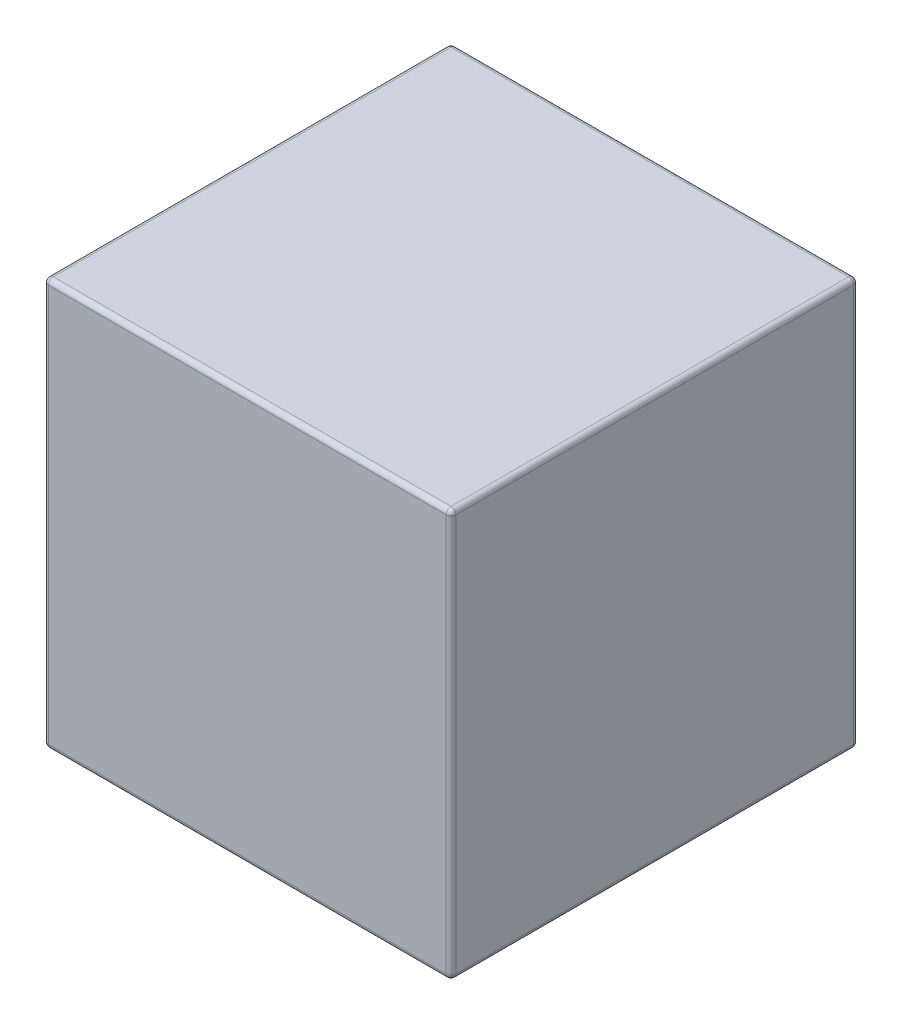
ISO-10303-21;
HEADER;
FILE_DESCRIPTION(('STEP AP214'),'2;1');
FILE_NAME('part.step','',(''),(''),'','','');
FILE_SCHEMA(('AUTOMOTIVE_DESIGN { 1 0 10303 214 1 1 1 1 }'));
ENDSEC;
DATA;
#1=APPLICATION_CONTEXT('core data for automotive mechanical design processes');
#2=APPLICATION_PROTOCOL_DEFINITION('international standard','automotive_design',2000,#1);
#3=PRODUCT_CONTEXT('',#1,'mechanical');
#4=PRODUCT('Part','Part','',(#3));
#5=PRODUCT_RELATED_PRODUCT_CATEGORY('part','',(#4));
#6=PRODUCT_DEFINITION_FORMATION('','',#4);
#7=PRODUCT_DEFINITION_CONTEXT('part definition',#1,'design');
#8=PRODUCT_DEFINITION('design','',#6,#7);
#9=PRODUCT_DEFINITION_SHAPE('','',#8);
#10=(LENGTH_UNIT() NAMED_UNIT(*) SI_UNIT(.MILLI.,.METRE.));
#11=(NAMED_UNIT(*) PLANE_ANGLE_UNIT() SI_UNIT($,.RADIAN.));
#12=(NAMED_UNIT(*) SI_UNIT($,.STERADIAN.) SOLID_ANGLE_UNIT());
#13=UNCERTAINTY_MEASURE_WITH_UNIT(LENGTH_MEASURE(1.E-05),#10,'distance_accuracy_value','');
#14=(GEOMETRIC_REPRESENTATION_CONTEXT(3) GLOBAL_UNCERTAINTY_ASSIGNED_CONTEXT((#13)) GLOBAL_UNIT_ASSIGNED_CONTEXT((#10,
#11,#12)) REPRESENTATION_CONTEXT('',''));
#15=CARTESIAN_POINT('',(0.,0.,0.));
#16=DIRECTION('',(0.,0.,1.));
#17=DIRECTION('',(1.,0.,0.));
#18=AXIS2_PLACEMENT_3D('',#15,#16,#17);
#19=CARTESIAN_POINT('',(0.,-42.,42.));
#20=DIRECTION('',(0.,1.,0.));
#21=DIRECTION('',(0.,0.,1.));
#22=AXIS2_PLACEMENT_3D('',#19,#20,#21);
#23=PLANE('',#22);
#24=DIRECTION('',(0.,0.,-1.));
#25=VECTOR('',#24,1.);
#26=CARTESIAN_POINT('',(14.25,-42.,38.25));
#27=LINE('',#26,#25);
#28=CARTESIAN_POINT('',(14.25,-42.,38.25));
#29=VERTEX_POINT('',#28);
#30=CARTESIAN_POINT('',(14.25,-42.,27.75));
#31=VERTEX_POINT('',#30);
#32=EDGE_CURVE('E58',#29,#31,#27,.T.);
#33=ORIENTED_EDGE('',*,*,#32,.T.);
#34=DIRECTION('',(-1.,0.,0.));
#35=VECTOR('',#34,1.);
#36=CARTESIAN_POINT('',(14.25,-42.,27.75));
#37=LINE('',#36,#35);
#38=CARTESIAN_POINT('',(3.75,-42.,27.75));
#39=VERTEX_POINT('',#38);
#40=EDGE_CURVE('E264',#31,#39,#37,.T.);
#41=ORIENTED_EDGE('',*,*,#40,.T.);
#42=DIRECTION('',(0.,0.,1.));
#43=VECTOR('',#42,1.);
#44=CARTESIAN_POINT('',(3.75000000000001,-42.,38.25));
#45=LINE('',#44,#43);
#46=CARTESIAN_POINT('',(3.75000000000001,-42.,38.25));
#47=VERTEX_POINT('',#46);
#48=EDGE_CURVE('E275',#39,#47,#45,.T.);
#49=ORIENTED_EDGE('',*,*,#48,.T.);
#50=DIRECTION('',(1.,0.,0.));
#51=VECTOR('',#50,1.);
#52=CARTESIAN_POINT('',(14.25,-42.,38.25));
#53=LINE('',#52,#51);
#54=EDGE_CURVE('E272',#47,#29,#53,.T.);
#55=ORIENTED_EDGE('',*,*,#54,.T.);
#56=EDGE_LOOP('',(#33,#41,#49,#55));
#57=FACE_BOUND('',#56,.T.);
#58=DIRECTION('',(1.,0.,0.));
#59=VECTOR('',#58,1.);
#60=CARTESIAN_POINT('',(0.,-42.,41.5));
#61=LINE('',#60,#59);
#62=CARTESIAN_POINT('',(41.5,-42.,41.5));
#63=VERTEX_POINT('',#62);
#64=CARTESIAN_POINT('',(0.500000000000005,-42.,41.5));
#65=VERTEX_POINT('',#64);
#66=EDGE_CURVE('E356',#63,#65,#61,.F.);
#67=ORIENTED_EDGE('',*,*,#66,.T.);
#68=DIRECTION('',(0.,0.,-1.));
#69=VECTOR('',#68,1.);
#70=CARTESIAN_POINT('',(0.500000000000005,-42.,42.));
#71=LINE('',#70,#69);
#72=CARTESIAN_POINT('',(0.500000000000005,-42.,0.5));
#73=VERTEX_POINT('',#72);
#74=EDGE_CURVE('E358',#65,#73,#71,.T.);
#75=ORIENTED_EDGE('',*,*,#74,.T.);
#76=DIRECTION('',(1.,0.,0.));
#77=VECTOR('',#76,1.);
#78=CARTESIAN_POINT('',(0.,-42.,0.5));
#79=LINE('',#78,#77);
#80=CARTESIAN_POINT('',(41.5,-42.,0.5));
#81=VERTEX_POINT('',#80);
#82=EDGE_CURVE('E346',#73,#81,#79,.T.);
#83=ORIENTED_EDGE('',*,*,#82,.T.);
#84=DIRECTION('',(0.,0.,-1.));
#85=VECTOR('',#84,1.);
#86=CARTESIAN_POINT('',(41.5,-42.,42.));
#87=LINE('',#86,#85);
#88=EDGE_CURVE('E354',#81,#63,#87,.F.);
#89=ORIENTED_EDGE('',*,*,#88,.T.);
#90=EDGE_LOOP('',(#67,#75,#83,#89));
#91=FACE_BOUND('',#90,.T.);
#92=DIRECTION('',(1.,0.,0.));
#93=VECTOR('',#92,1.);
#94=CARTESIAN_POINT('',(27.75,-42.,3.75));
#95=LINE('',#94,#93);
#96=CARTESIAN_POINT('',(27.75,-42.,3.75));
#97=VERTEX_POINT('',#96);
#98=CARTESIAN_POINT('',(38.25,-42.,3.75));
#99=VERTEX_POINT('',#98);
#100=EDGE_CURVE('E304',#97,#99,#95,.T.);
#101=ORIENTED_EDGE('',*,*,#100,.F.);
#102=DIRECTION('',(0.,0.,-1.));
#103=VECTOR('',#102,1.);
#104=CARTESIAN_POINT('',(27.75,-42.,14.25));
#105=LINE('',#104,#103);
#106=CARTESIAN_POINT('',(27.75,-42.,14.25));
#107=VERTEX_POINT('',#106);
#108=EDGE_CURVE('E302',#107,#97,#105,.T.);
#109=ORIENTED_EDGE('',*,*,#108,.F.);
#110=DIRECTION('',(-1.,0.,0.));
#111=VECTOR('',#110,1.);
#112=CARTESIAN_POINT('',(27.75,-42.,14.25));
#113=LINE('',#112,#111);
#114=CARTESIAN_POINT('',(38.25,-42.,14.25));
#115=VERTEX_POINT('',#114);
#116=EDGE_CURVE('E292',#115,#107,#113,.T.);
#117=ORIENTED_EDGE('',*,*,#116,.F.);
#118=DIRECTION('',(0.,0.,1.));
#119=VECTOR('',#118,1.);
#120=CARTESIAN_POINT('',(38.25,-42.,14.25));
#121=LINE('',#120,#119);
#122=EDGE_CURVE('E307',#99,#115,#121,.T.);
#123=ORIENTED_EDGE('',*,*,#122,.F.);
#124=EDGE_LOOP('',(#101,#109,#117,#123));
#125=FACE_BOUND('',#124,.T.);
#126=DIRECTION('',(1.,0.,0.));
#127=VECTOR('',#126,1.);
#128=CARTESIAN_POINT('',(27.75,-42.,27.75));
#129=LINE('',#128,#127);
#130=CARTESIAN_POINT('',(27.75,-42.,27.75));
#131=VERTEX_POINT('',#130);
#132=CARTESIAN_POINT('',(38.25,-42.,27.75));
#133=VERTEX_POINT('',#132);
#134=EDGE_CURVE('E336',#131,#133,#129,.T.);
#135=ORIENTED_EDGE('',*,*,#134,.F.);
#136=DIRECTION('',(0.,0.,-1.));
#137=VECTOR('',#136,1.);
#138=CARTESIAN_POINT('',(27.75,-42.,38.25));
#139=LINE('',#138,#137);
#140=CARTESIAN_POINT('',(27.75,-42.,38.25));
#141=VERTEX_POINT('',#140);
#142=EDGE_CURVE('E314',#141,#131,#139,.T.);
#143=ORIENTED_EDGE('',*,*,#142,.F.);
#144=DIRECTION('',(-1.,0.,0.));
#145=VECTOR('',#144,1.);
#146=CARTESIAN_POINT('',(27.75,-42.,38.25));
#147=LINE('',#146,#145);
#148=CARTESIAN_POINT('',(38.25,-42.,38.25));
#149=VERTEX_POINT('',#148);
#150=EDGE_CURVE('E325',#149,#141,#147,.T.);
#151=ORIENTED_EDGE('',*,*,#150,.F.);
#152=DIRECTION('',(0.,0.,1.));
#153=VECTOR('',#152,1.);
#154=CARTESIAN_POINT('',(38.25,-42.,38.25));
#155=LINE('',#154,#153);
#156=EDGE_CURVE('E339',#133,#149,#155,.T.);
#157=ORIENTED_EDGE('',*,*,#156,.F.);
#158=EDGE_LOOP('',(#135,#143,#151,#157));
#159=FACE_BOUND('',#158,.T.);
#160=DIRECTION('',(0.,0.,-1.));
#161=VECTOR('',#160,1.);
#162=CARTESIAN_POINT('',(14.25,-42.,14.25));
#163=LINE('',#162,#161);
#164=CARTESIAN_POINT('',(14.25,-42.,14.25));
#165=VERTEX_POINT('',#164);
#166=CARTESIAN_POINT('',(14.25,-42.,3.75));
#167=VERTEX_POINT('',#166);
#168=EDGE_CURVE('E50',#165,#167,#163,.T.);
#169=ORIENTED_EDGE('',*,*,#168,.T.);
#170=DIRECTION('',(-1.,0.,0.));
#171=VECTOR('',#170,1.);
#172=CARTESIAN_POINT('',(14.25,-42.,3.75));
#173=LINE('',#172,#171);
#174=CARTESIAN_POINT('',(3.75,-42.,3.75));
#175=VERTEX_POINT('',#174);
#176=EDGE_CURVE('E242',#167,#175,#173,.T.);
#177=ORIENTED_EDGE('',*,*,#176,.T.);
#178=DIRECTION('',(0.,0.,1.));
#179=VECTOR('',#178,1.);
#180=CARTESIAN_POINT('',(3.75,-42.,14.25));
#181=LINE('',#180,#179);
#182=CARTESIAN_POINT('',(3.75,-42.,14.25));
#183=VERTEX_POINT('',#182);
#184=EDGE_CURVE('E245',#175,#183,#181,.T.);
#185=ORIENTED_EDGE('',*,*,#184,.T.);
#186=DIRECTION('',(1.,0.,0.));
#187=VECTOR('',#186,1.);
#188=CARTESIAN_POINT('',(14.25,-42.,14.25));
#189=LINE('',#188,#187);
#190=EDGE_CURVE('E251',#183,#165,#189,.T.);
#191=ORIENTED_EDGE('',*,*,#190,.T.);
#192=EDGE_LOOP('',(#169,#177,#185,#191));
#193=FACE_BOUND('',#192,.T.);
#194=ADVANCED_FACE('F33',(#57,#91,#125,#159,#193),#23,.F.);
#195=CARTESIAN_POINT('',(0.,0.,42.));
#196=DIRECTION('',(1.,0.,0.));
#197=DIRECTION('',(0.,1.,0.));
#198=AXIS2_PLACEMENT_3D('',#195,#196,#197);
#199=PLANE('',#198);
#200=DIRECTION('',(0.,-1.,0.));
#201=VECTOR('',#200,1.);
#202=CARTESIAN_POINT('',(0.,0.,0.5));
#203=LINE('',#202,#201);
#204=CARTESIAN_POINT('',(0.,-0.5,0.5));
#205=VERTEX_POINT('',#204);
#206=CARTESIAN_POINT('',(0.,-41.5,0.5));
#207=VERTEX_POINT('',#206);
#208=EDGE_CURVE('E363',#205,#207,#203,.T.);
#209=ORIENTED_EDGE('',*,*,#208,.T.);
#210=DIRECTION('',(0.,0.,-1.));
#211=VECTOR('',#210,1.);
#212=CARTESIAN_POINT('',(0.,-41.5,42.));
#213=LINE('',#212,#211);
#214=CARTESIAN_POINT('',(0.,-41.5,41.5));
#215=VERTEX_POINT('',#214);
#216=EDGE_CURVE('E367',#207,#215,#213,.F.);
#217=ORIENTED_EDGE('',*,*,#216,.T.);
#218=DIRECTION('',(0.,-1.,0.));
#219=VECTOR('',#218,1.);
#220=CARTESIAN_POINT('',(0.,0.,41.5));
#221=LINE('',#220,#219);
#222=CARTESIAN_POINT('',(0.,-0.5,41.5));
#223=VERTEX_POINT('',#222);
#224=EDGE_CURVE('E365',#215,#223,#221,.F.);
#225=ORIENTED_EDGE('',*,*,#224,.T.);
#226=DIRECTION('',(0.,0.,-1.));
#227=VECTOR('',#226,1.);
#228=CARTESIAN_POINT('',(0.,-0.5,42.));
#229=LINE('',#228,#227);
#230=EDGE_CURVE('E361',#223,#205,#229,.T.);
#231=ORIENTED_EDGE('',*,*,#230,.T.);
#232=EDGE_LOOP('',(#209,#217,#225,#231));
#233=FACE_BOUND('',#232,.T.);
#234=ADVANCED_FACE('F529',(#233),#199,.F.);
#235=CARTESIAN_POINT('',(42.,0.,42.));
#236=DIRECTION('',(-1.,0.,0.));
#237=DIRECTION('',(0.,-1.,0.));
#238=AXIS2_PLACEMENT_3D('',#235,#236,#237);
#239=PLANE('',#238);
#240=DIRECTION('',(0.,1.,0.));
#241=VECTOR('',#240,1.);
#242=CARTESIAN_POINT('',(42.,-42.,41.5));
#243=LINE('',#242,#241);
#244=CARTESIAN_POINT('',(42.,-0.5,41.5));
#245=VERTEX_POINT('',#244);
#246=CARTESIAN_POINT('',(42.,-41.5,41.5));
#247=VERTEX_POINT('',#246);
#248=EDGE_CURVE('E383',#245,#247,#243,.F.);
#249=ORIENTED_EDGE('',*,*,#248,.T.);
#250=DIRECTION('',(0.,0.,-1.));
#251=VECTOR('',#250,1.);
#252=CARTESIAN_POINT('',(42.,-41.5,42.));
#253=LINE('',#252,#251);
#254=CARTESIAN_POINT('',(42.,-41.5,0.5));
#255=VERTEX_POINT('',#254);
#256=EDGE_CURVE('E385',#247,#255,#253,.T.);
#257=ORIENTED_EDGE('',*,*,#256,.T.);
#258=DIRECTION('',(0.,1.,0.));
#259=VECTOR('',#258,1.);
#260=CARTESIAN_POINT('',(42.,0.,0.5));
#261=LINE('',#260,#259);
#262=CARTESIAN_POINT('',(42.,-0.5,0.5));
#263=VERTEX_POINT('',#262);
#264=EDGE_CURVE('E381',#255,#263,#261,.T.);
#265=ORIENTED_EDGE('',*,*,#264,.T.);
#266=DIRECTION('',(0.,0.,-1.));
#267=VECTOR('',#266,1.);
#268=CARTESIAN_POINT('',(42.,-0.5,42.));
#269=LINE('',#268,#267);
#270=EDGE_CURVE('E379',#263,#245,#269,.F.);
#271=ORIENTED_EDGE('',*,*,#270,.T.);
#272=EDGE_LOOP('',(#249,#257,#265,#271));
#273=FACE_BOUND('',#272,.T.);
#274=ADVANCED_FACE('F494',(#273),#239,.F.);
#275=CARTESIAN_POINT('',(0.,0.,42.));
#276=DIRECTION('',(0.,-1.,0.));
#277=DIRECTION('',(0.,0.,-1.));
#278=AXIS2_PLACEMENT_3D('',#275,#276,#277);
#279=PLANE('',#278);
#280=DIRECTION('',(-1.,0.,0.));
#281=VECTOR('',#280,1.);
#282=CARTESIAN_POINT('',(42.,0.,41.5));
#283=LINE('',#282,#281);
#284=CARTESIAN_POINT('',(0.5,0.,41.5));
#285=VERTEX_POINT('',#284);
#286=CARTESIAN_POINT('',(41.5,0.,41.5));
#287=VERTEX_POINT('',#286);
#288=EDGE_CURVE('E42',#285,#287,#283,.F.);
#289=ORIENTED_EDGE('',*,*,#288,.T.);
#290=DIRECTION('',(0.,0.,-1.));
#291=VECTOR('',#290,1.);
#292=CARTESIAN_POINT('',(41.5,0.,42.));
#293=LINE('',#292,#291);
#294=CARTESIAN_POINT('',(41.5,0.,0.5));
#295=VERTEX_POINT('',#294);
#296=EDGE_CURVE('E11',#287,#295,#293,.T.);
#297=ORIENTED_EDGE('',*,*,#296,.T.);
#298=DIRECTION('',(-1.,0.,0.));
#299=VECTOR('',#298,1.);
#300=CARTESIAN_POINT('',(0.,0.,0.5));
#301=LINE('',#300,#299);
#302=CARTESIAN_POINT('',(0.5,0.,0.5));
#303=VERTEX_POINT('',#302);
#304=EDGE_CURVE('E397',#295,#303,#301,.T.);
#305=ORIENTED_EDGE('',*,*,#304,.T.);
#306=DIRECTION('',(0.,0.,-1.));
#307=VECTOR('',#306,1.);
#308=CARTESIAN_POINT('',(0.5,0.,42.));
#309=LINE('',#308,#307);
#310=EDGE_CURVE('E399',#303,#285,#309,.F.);
#311=ORIENTED_EDGE('',*,*,#310,.T.);
#312=EDGE_LOOP('',(#289,#297,#305,#311));
#313=FACE_BOUND('',#312,.T.);
#314=ADVANCED_FACE('F509',(#313),#279,.F.);
#315=CARTESIAN_POINT('',(0.,0.,42.));
#316=DIRECTION('',(0.,0.,1.));
#317=DIRECTION('',(1.,0.,0.));
#318=AXIS2_PLACEMENT_3D('',#315,#316,#317);
#319=PLANE('',#318);
#320=DIRECTION('',(0.,-1.,0.));
#321=VECTOR('',#320,1.);
#322=CARTESIAN_POINT('',(0.500000000000005,-42.,42.));
#323=LINE('',#322,#321);
#324=CARTESIAN_POINT('',(0.5,-0.5,42.));
#325=VERTEX_POINT('',#324);
#326=CARTESIAN_POINT('',(0.500000000000005,-41.5,42.));
#327=VERTEX_POINT('',#326);
#328=EDGE_CURVE('E374',#325,#327,#323,.T.);
#329=ORIENTED_EDGE('',*,*,#328,.T.);
#330=DIRECTION('',(1.,0.,0.));
#331=VECTOR('',#330,1.);
#332=CARTESIAN_POINT('',(42.,-41.5,42.));
#333=LINE('',#332,#331);
#334=CARTESIAN_POINT('',(41.5,-41.5,42.));
#335=VERTEX_POINT('',#334);
#336=EDGE_CURVE('E376',#327,#335,#333,.T.);
#337=ORIENTED_EDGE('',*,*,#336,.T.);
#338=DIRECTION('',(0.,1.,0.));
#339=VECTOR('',#338,1.);
#340=CARTESIAN_POINT('',(41.5,0.,42.));
#341=LINE('',#340,#339);
#342=CARTESIAN_POINT('',(41.5,-0.5,42.));
#343=VERTEX_POINT('',#342);
#344=EDGE_CURVE('E372',#335,#343,#341,.T.);
#345=ORIENTED_EDGE('',*,*,#344,.T.);
#346=DIRECTION('',(-1.,0.,0.));
#347=VECTOR('',#346,1.);
#348=CARTESIAN_POINT('',(0.,-0.5,42.));
#349=LINE('',#348,#347);
#350=EDGE_CURVE('E370',#343,#325,#349,.T.);
#351=ORIENTED_EDGE('',*,*,#350,.T.);
#352=EDGE_LOOP('',(#329,#337,#345,#351));
#353=FACE_BOUND('',#352,.T.);
#354=ADVANCED_FACE('F485',(#353),#319,.T.);
#355=CARTESIAN_POINT('',(0.,0.,0.));
#356=DIRECTION('',(0.,0.,1.));
#357=DIRECTION('',(1.,0.,0.));
#358=AXIS2_PLACEMENT_3D('',#355,#356,#357);
#359=PLANE('',#358);
#360=DIRECTION('',(0.,1.,0.));
#361=VECTOR('',#360,1.);
#362=CARTESIAN_POINT('',(41.5,0.,0.));
#363=LINE('',#362,#361);
#364=CARTESIAN_POINT('',(41.5,-0.5,0.));
#365=VERTEX_POINT('',#364);
#366=CARTESIAN_POINT('',(41.5,-41.5,0.));
#367=VERTEX_POINT('',#366);
#368=EDGE_CURVE('E392',#365,#367,#363,.F.);
#369=ORIENTED_EDGE('',*,*,#368,.T.);
#370=DIRECTION('',(1.,0.,0.));
#371=VECTOR('',#370,1.);
#372=CARTESIAN_POINT('',(0.,-41.5,0.));
#373=LINE('',#372,#371);
#374=CARTESIAN_POINT('',(0.500000000000005,-41.5,0.));
#375=VERTEX_POINT('',#374);
#376=EDGE_CURVE('E394',#367,#375,#373,.F.);
#377=ORIENTED_EDGE('',*,*,#376,.T.);
#378=DIRECTION('',(0.,-1.,0.));
#379=VECTOR('',#378,1.);
#380=CARTESIAN_POINT('',(0.5,0.,0.));
#381=LINE('',#380,#379);
#382=CARTESIAN_POINT('',(0.5,-0.5,0.));
#383=VERTEX_POINT('',#382);
#384=EDGE_CURVE('E390',#375,#383,#381,.F.);
#385=ORIENTED_EDGE('',*,*,#384,.T.);
#386=DIRECTION('',(-1.,0.,0.));
#387=VECTOR('',#386,1.);
#388=CARTESIAN_POINT('',(0.,-0.5,0.));
#389=LINE('',#388,#387);
#390=EDGE_CURVE('E388',#383,#365,#389,.F.);
#391=ORIENTED_EDGE('',*,*,#390,.T.);
#392=EDGE_LOOP('',(#369,#377,#385,#391));
#393=FACE_BOUND('',#392,.T.);
#394=ADVANCED_FACE('F825',(#393),#359,.F.);
#395=CARTESIAN_POINT('',(27.75,-37.5,38.25));
#396=DIRECTION('',(-1.,0.,0.));
#397=DIRECTION('',(0.,0.,1.));
#398=AXIS2_PLACEMENT_3D('',#395,#396,#397);
#399=PLANE('',#398);
#400=ORIENTED_EDGE('',*,*,#142,.T.);
#401=DIRECTION('',(0.,-1.,0.));
#402=VECTOR('',#401,1.);
#403=CARTESIAN_POINT('',(27.75,-37.5,27.75));
#404=LINE('',#403,#402);
#405=CARTESIAN_POINT('',(27.75,-37.5,27.75));
#406=VERTEX_POINT('',#405);
#407=EDGE_CURVE('E334',#406,#131,#404,.T.);
#408=ORIENTED_EDGE('',*,*,#407,.F.);
#409=DIRECTION('',(0.,0.,-1.));
#410=VECTOR('',#409,1.);
#411=CARTESIAN_POINT('',(27.75,-37.5,38.25));
#412=LINE('',#411,#410);
#413=CARTESIAN_POINT('',(27.75,-37.5,38.25));
#414=VERTEX_POINT('',#413);
#415=EDGE_CURVE('E321',#414,#406,#412,.T.);
#416=ORIENTED_EDGE('',*,*,#415,.F.);
#417=DIRECTION('',(0.,-1.,0.));
#418=VECTOR('',#417,1.);
#419=CARTESIAN_POINT('',(27.75,-37.5,38.25));
#420=LINE('',#419,#418);
#421=EDGE_CURVE('E344',#414,#141,#420,.T.);
#422=ORIENTED_EDGE('',*,*,#421,.T.);
#423=EDGE_LOOP('',(#400,#408,#416,#422));
#424=FACE_BOUND('',#423,.T.);
#425=ADVANCED_FACE('F830',(#424),#399,.F.);
#426=CARTESIAN_POINT('',(27.75,-37.5,38.25));
#427=DIRECTION('',(0.,0.,1.));
#428=DIRECTION('',(1.,0.,0.));
#429=AXIS2_PLACEMENT_3D('',#426,#427,#428);
#430=PLANE('',#429);
#431=ORIENTED_EDGE('',*,*,#150,.T.);
#432=ORIENTED_EDGE('',*,*,#421,.F.);
#433=DIRECTION('',(-1.,0.,0.));
#434=VECTOR('',#433,1.);
#435=CARTESIAN_POINT('',(27.75,-37.5,38.25));
#436=LINE('',#435,#434);
#437=CARTESIAN_POINT('',(38.25,-37.5,38.25));
#438=VERTEX_POINT('',#437);
#439=EDGE_CURVE('E331',#438,#414,#436,.T.);
#440=ORIENTED_EDGE('',*,*,#439,.F.);
#441=DIRECTION('',(0.,-1.,0.));
#442=VECTOR('',#441,1.);
#443=CARTESIAN_POINT('',(38.25,-37.5,38.25));
#444=LINE('',#443,#442);
#445=EDGE_CURVE('E347',#438,#149,#444,.T.);
#446=ORIENTED_EDGE('',*,*,#445,.T.);
#447=EDGE_LOOP('',(#431,#432,#440,#446));
#448=FACE_BOUND('',#447,.T.);
#449=ADVANCED_FACE('F938',(#448),#430,.F.);
#450=CARTESIAN_POINT('',(38.25,-37.5,38.25));
#451=DIRECTION('',(1.,0.,0.));
#452=DIRECTION('',(0.,0.,-1.));
#453=AXIS2_PLACEMENT_3D('',#450,#451,#452);
#454=PLANE('',#453);
#455=ORIENTED_EDGE('',*,*,#156,.T.);
#456=ORIENTED_EDGE('',*,*,#445,.F.);
#457=DIRECTION('',(0.,0.,1.));
#458=VECTOR('',#457,1.);
#459=CARTESIAN_POINT('',(38.25,-37.5,38.25));
#460=LINE('',#459,#458);
#461=CARTESIAN_POINT('',(38.25,-37.5,27.75));
#462=VERTEX_POINT('',#461);
#463=EDGE_CURVE('E328',#462,#438,#460,.T.);
#464=ORIENTED_EDGE('',*,*,#463,.F.);
#465=DIRECTION('',(0.,-1.,0.));
#466=VECTOR('',#465,1.);
#467=CARTESIAN_POINT('',(38.25,-37.5,27.75));
#468=LINE('',#467,#466);
#469=EDGE_CURVE('E349',#462,#133,#468,.T.);
#470=ORIENTED_EDGE('',*,*,#469,.T.);
#471=EDGE_LOOP('',(#455,#456,#464,#470));
#472=FACE_BOUND('',#471,.T.);
#473=ADVANCED_FACE('F928',(#472),#454,.F.);
#474=CARTESIAN_POINT('',(27.75,-37.5,27.75));
#475=DIRECTION('',(0.,0.,-1.));
#476=DIRECTION('',(-1.,0.,0.));
#477=AXIS2_PLACEMENT_3D('',#474,#475,#476);
#478=PLANE('',#477);
#479=ORIENTED_EDGE('',*,*,#134,.T.);
#480=ORIENTED_EDGE('',*,*,#469,.F.);
#481=DIRECTION('',(1.,0.,0.));
#482=VECTOR('',#481,1.);
#483=CARTESIAN_POINT('',(27.75,-37.5,27.75));
#484=LINE('',#483,#482);
#485=EDGE_CURVE('E324',#406,#462,#484,.T.);
#486=ORIENTED_EDGE('',*,*,#485,.F.);
#487=ORIENTED_EDGE('',*,*,#407,.T.);
#488=EDGE_LOOP('',(#479,#480,#486,#487));
#489=FACE_BOUND('',#488,.T.);
#490=ADVANCED_FACE('F918',(#489),#478,.F.);
#491=CARTESIAN_POINT('',(0.,-37.5,0.));
#492=DIRECTION('',(0.,-1.,0.));
#493=DIRECTION('',(0.,0.,-1.));
#494=AXIS2_PLACEMENT_3D('',#491,#492,#493);
#495=PLANE('',#494);
#496=ORIENTED_EDGE('',*,*,#415,.T.);
#497=ORIENTED_EDGE('',*,*,#485,.T.);
#498=ORIENTED_EDGE('',*,*,#463,.T.);
#499=ORIENTED_EDGE('',*,*,#439,.T.);
#500=EDGE_LOOP('',(#496,#497,#498,#499));
#501=FACE_BOUND('',#500,.T.);
#502=ADVANCED_FACE('F908',(#501),#495,.T.);
#503=CARTESIAN_POINT('',(27.75,-37.5,14.25));
#504=DIRECTION('',(-1.,0.,0.));
#505=DIRECTION('',(0.,0.,1.));
#506=AXIS2_PLACEMENT_3D('',#503,#504,#505);
#507=PLANE('',#506);
#508=ORIENTED_EDGE('',*,*,#108,.T.);
#509=DIRECTION('',(0.,-1.,0.));
#510=VECTOR('',#509,1.);
#511=CARTESIAN_POINT('',(27.75,-37.5,3.75));
#512=LINE('',#511,#510);
#513=CARTESIAN_POINT('',(27.75,-37.5,3.75));
#514=VERTEX_POINT('',#513);
#515=EDGE_CURVE('E301',#514,#97,#512,.T.);
#516=ORIENTED_EDGE('',*,*,#515,.F.);
#517=DIRECTION('',(0.,0.,-1.));
#518=VECTOR('',#517,1.);
#519=CARTESIAN_POINT('',(27.75,-37.5,14.25));
#520=LINE('',#519,#518);
#521=CARTESIAN_POINT('',(27.75,-37.5,14.25));
#522=VERTEX_POINT('',#521);
#523=EDGE_CURVE('E288',#522,#514,#520,.T.);
#524=ORIENTED_EDGE('',*,*,#523,.F.);
#525=DIRECTION('',(0.,-1.,0.));
#526=VECTOR('',#525,1.);
#527=CARTESIAN_POINT('',(27.75,-37.5,14.25));
#528=LINE('',#527,#526);
#529=EDGE_CURVE('E312',#522,#107,#528,.T.);
#530=ORIENTED_EDGE('',*,*,#529,.T.);
#531=EDGE_LOOP('',(#508,#516,#524,#530));
#532=FACE_BOUND('',#531,.T.);
#533=ADVANCED_FACE('F898',(#532),#507,.F.);
#534=CARTESIAN_POINT('',(27.75,-37.5,14.25));
#535=DIRECTION('',(0.,0.,1.));
#536=DIRECTION('',(1.,0.,0.));
#537=AXIS2_PLACEMENT_3D('',#534,#535,#536);
#538=PLANE('',#537);
#539=ORIENTED_EDGE('',*,*,#116,.T.);
#540=ORIENTED_EDGE('',*,*,#529,.F.);
#541=DIRECTION('',(-1.,0.,0.));
#542=VECTOR('',#541,1.);
#543=CARTESIAN_POINT('',(27.75,-37.5,14.25));
#544=LINE('',#543,#542);
#545=CARTESIAN_POINT('',(38.25,-37.5,14.25));
#546=VERTEX_POINT('',#545);
#547=EDGE_CURVE('E298',#546,#522,#544,.T.);
#548=ORIENTED_EDGE('',*,*,#547,.F.);
#549=DIRECTION('',(0.,-1.,0.));
#550=VECTOR('',#549,1.);
#551=CARTESIAN_POINT('',(38.25,-37.5,14.25));
#552=LINE('',#551,#550);
#553=EDGE_CURVE('E315',#546,#115,#552,.T.);
#554=ORIENTED_EDGE('',*,*,#553,.T.);
#555=EDGE_LOOP('',(#539,#540,#548,#554));
#556=FACE_BOUND('',#555,.T.);
#557=ADVANCED_FACE('F888',(#556),#538,.F.);
#558=CARTESIAN_POINT('',(38.25,-37.5,14.25));
#559=DIRECTION('',(1.,0.,0.));
#560=DIRECTION('',(0.,0.,-1.));
#561=AXIS2_PLACEMENT_3D('',#558,#559,#560);
#562=PLANE('',#561);
#563=ORIENTED_EDGE('',*,*,#122,.T.);
#564=ORIENTED_EDGE('',*,*,#553,.F.);
#565=DIRECTION('',(0.,0.,1.));
#566=VECTOR('',#565,1.);
#567=CARTESIAN_POINT('',(38.25,-37.5,14.25));
#568=LINE('',#567,#566);
#569=CARTESIAN_POINT('',(38.25,-37.5,3.75));
#570=VERTEX_POINT('',#569);
#571=EDGE_CURVE('E295',#570,#546,#568,.T.);
#572=ORIENTED_EDGE('',*,*,#571,.F.);
#573=DIRECTION('',(0.,-1.,0.));
#574=VECTOR('',#573,1.);
#575=CARTESIAN_POINT('',(38.25,-37.5,3.75));
#576=LINE('',#575,#574);
#577=EDGE_CURVE('E317',#570,#99,#576,.T.);
#578=ORIENTED_EDGE('',*,*,#577,.T.);
#579=EDGE_LOOP('',(#563,#564,#572,#578));
#580=FACE_BOUND('',#579,.T.);
#581=ADVANCED_FACE('F878',(#580),#562,.F.);
#582=CARTESIAN_POINT('',(27.75,-37.5,3.75));
#583=DIRECTION('',(0.,0.,-1.));
#584=DIRECTION('',(-1.,0.,0.));
#585=AXIS2_PLACEMENT_3D('',#582,#583,#584);
#586=PLANE('',#585);
#587=ORIENTED_EDGE('',*,*,#100,.T.);
#588=ORIENTED_EDGE('',*,*,#577,.F.);
#589=DIRECTION('',(1.,0.,0.));
#590=VECTOR('',#589,1.);
#591=CARTESIAN_POINT('',(27.75,-37.5,3.75));
#592=LINE('',#591,#590);
#593=EDGE_CURVE('E291',#514,#570,#592,.T.);
#594=ORIENTED_EDGE('',*,*,#593,.F.);
#595=ORIENTED_EDGE('',*,*,#515,.T.);
#596=EDGE_LOOP('',(#587,#588,#594,#595));
#597=FACE_BOUND('',#596,.T.);
#598=ADVANCED_FACE('F868',(#597),#586,.F.);
#599=CARTESIAN_POINT('',(0.,-37.5,0.));
#600=DIRECTION('',(0.,-1.,0.));
#601=DIRECTION('',(0.,0.,-1.));
#602=AXIS2_PLACEMENT_3D('',#599,#600,#601);
#603=PLANE('',#602);
#604=ORIENTED_EDGE('',*,*,#523,.T.);
#605=ORIENTED_EDGE('',*,*,#593,.T.);
#606=ORIENTED_EDGE('',*,*,#571,.T.);
#607=ORIENTED_EDGE('',*,*,#547,.T.);
#608=EDGE_LOOP('',(#604,#605,#606,#607));
#609=FACE_BOUND('',#608,.T.);
#610=ADVANCED_FACE('F819',(#609),#603,.T.);
#611=CARTESIAN_POINT('',(41.5,-0.5,42.));
#612=DIRECTION('',(0.,0.,-1.));
#613=DIRECTION('',(-1.,0.,0.));
#614=AXIS2_PLACEMENT_3D('',#611,#612,#613);
#615=CYLINDRICAL_SURFACE('',#614,0.5);
#616=CARTESIAN_POINT('',(41.5,-0.5,41.5));
#617=DIRECTION('',(0.,0.,1.));
#618=DIRECTION('',(1.,0.,0.));
#619=AXIS2_PLACEMENT_3D('',#616,#617,#618);
#620=CIRCLE('',#619,0.5);
#621=EDGE_CURVE('E37',#245,#287,#620,.T.);
#622=ORIENTED_EDGE('',*,*,#621,.F.);
#623=ORIENTED_EDGE('',*,*,#270,.F.);
#624=CARTESIAN_POINT('',(41.5,-0.5,0.5));
#625=DIRECTION('',(0.,0.,-1.));
#626=DIRECTION('',(-1.,0.,0.));
#627=AXIS2_PLACEMENT_3D('',#624,#625,#626);
#628=CIRCLE('',#627,0.5);
#629=EDGE_CURVE('E461',#295,#263,#628,.T.);
#630=ORIENTED_EDGE('',*,*,#629,.F.);
#631=ORIENTED_EDGE('',*,*,#296,.F.);
#632=EDGE_LOOP('',(#622,#623,#630,#631));
#633=FACE_BOUND('',#632,.T.);
#634=ADVANCED_FACE('F35',(#633),#615,.T.);
#635=CARTESIAN_POINT('',(41.5,-0.5,41.5));
#636=DIRECTION('',(0.,0.,1.));
#637=DIRECTION('',(1.,0.,0.));
#638=AXIS2_PLACEMENT_3D('',#635,#636,#637);
#639=SPHERICAL_SURFACE('',#638,0.5);
#640=CARTESIAN_POINT('',(41.5,-0.5,41.5));
#641=DIRECTION('',(0.,1.,0.));
#642=DIRECTION('',(-1.,0.,0.));
#643=AXIS2_PLACEMENT_3D('',#640,#641,#642);
#644=CIRCLE('',#643,0.5);
#645=EDGE_CURVE('E456',#245,#343,#644,.F.);
#646=ORIENTED_EDGE('',*,*,#645,.F.);
#647=ORIENTED_EDGE('',*,*,#621,.T.);
#648=CARTESIAN_POINT('',(41.5,-0.5,41.5));
#649=DIRECTION('',(1.,0.,0.));
#650=DIRECTION('',(0.,0.,-1.));
#651=AXIS2_PLACEMENT_3D('',#648,#649,#650);
#652=CIRCLE('',#651,0.5);
#653=EDGE_CURVE('E459',#343,#287,#652,.F.);
#654=ORIENTED_EDGE('',*,*,#653,.F.);
#655=EDGE_LOOP('',(#646,#647,#654));
#656=FACE_BOUND('',#655,.T.);
#657=ADVANCED_FACE('F472',(#656),#639,.T.);
#658=CARTESIAN_POINT('',(41.5,-0.5,0.5));
#659=DIRECTION('',(0.,0.,1.));
#660=DIRECTION('',(1.,0.,0.));
#661=AXIS2_PLACEMENT_3D('',#658,#659,#660);
#662=SPHERICAL_SURFACE('',#661,0.5);
#663=CARTESIAN_POINT('',(41.5,-0.5,0.5));
#664=DIRECTION('',(1.,0.,0.));
#665=DIRECTION('',(0.,0.,-1.));
#666=AXIS2_PLACEMENT_3D('',#663,#664,#665);
#667=CIRCLE('',#666,0.5);
#668=EDGE_CURVE('E450',#295,#365,#667,.F.);
#669=ORIENTED_EDGE('',*,*,#668,.F.);
#670=ORIENTED_EDGE('',*,*,#629,.T.);
#671=CARTESIAN_POINT('',(41.5,-0.5,0.5));
#672=DIRECTION('',(0.,1.,0.));
#673=DIRECTION('',(-1.,0.,0.));
#674=AXIS2_PLACEMENT_3D('',#671,#672,#673);
#675=CIRCLE('',#674,0.5);
#676=EDGE_CURVE('E453',#365,#263,#675,.F.);
#677=ORIENTED_EDGE('',*,*,#676,.F.);
#678=EDGE_LOOP('',(#669,#670,#677));
#679=FACE_BOUND('',#678,.T.);
#680=ADVANCED_FACE('F795',(#679),#662,.T.);
#681=CARTESIAN_POINT('',(0.,-0.5,41.5));
#682=DIRECTION('',(1.,0.,0.));
#683=DIRECTION('',(0.,0.,-1.));
#684=AXIS2_PLACEMENT_3D('',#681,#682,#683);
#685=CYLINDRICAL_SURFACE('',#684,0.5);
#686=ORIENTED_EDGE('',*,*,#653,.T.);
#687=ORIENTED_EDGE('',*,*,#288,.F.);
#688=CARTESIAN_POINT('',(0.5,-0.5,41.5));
#689=DIRECTION('',(-1.,0.,0.));
#690=DIRECTION('',(0.,-1.,0.));
#691=AXIS2_PLACEMENT_3D('',#688,#689,#690);
#692=CIRCLE('',#691,0.5);
#693=EDGE_CURVE('E444',#325,#285,#692,.T.);
#694=ORIENTED_EDGE('',*,*,#693,.F.);
#695=ORIENTED_EDGE('',*,*,#350,.F.);
#696=EDGE_LOOP('',(#686,#687,#694,#695));
#697=FACE_BOUND('',#696,.T.);
#698=ADVANCED_FACE('F480',(#697),#685,.T.);
#699=CARTESIAN_POINT('',(41.5,0.,41.5));
#700=DIRECTION('',(0.,-1.,0.));
#701=DIRECTION('',(1.,0.,0.));
#702=AXIS2_PLACEMENT_3D('',#699,#700,#701);
#703=CYLINDRICAL_SURFACE('',#702,0.5);
#704=ORIENTED_EDGE('',*,*,#645,.T.);
#705=ORIENTED_EDGE('',*,*,#344,.F.);
#706=CARTESIAN_POINT('',(41.5,-41.5,41.5));
#707=DIRECTION('',(0.,-1.,0.));
#708=DIRECTION('',(0.,0.,-1.));
#709=AXIS2_PLACEMENT_3D('',#706,#707,#708);
#710=CIRCLE('',#709,0.5);
#711=EDGE_CURVE('E441',#247,#335,#710,.T.);
#712=ORIENTED_EDGE('',*,*,#711,.F.);
#713=ORIENTED_EDGE('',*,*,#248,.F.);
#714=EDGE_LOOP('',(#704,#705,#712,#713));
#715=FACE_BOUND('',#714,.T.);
#716=ADVANCED_FACE('F491',(#715),#703,.T.);
#717=CARTESIAN_POINT('',(41.5,-41.5,42.));
#718=DIRECTION('',(0.,0.,-1.));
#719=DIRECTION('',(-1.,0.,0.));
#720=AXIS2_PLACEMENT_3D('',#717,#718,#719);
#721=CYLINDRICAL_SURFACE('',#720,0.5);
#722=CARTESIAN_POINT('',(41.5,-41.5,0.5));
#723=DIRECTION('',(0.,0.,-1.));
#724=DIRECTION('',(-1.,0.,0.));
#725=AXIS2_PLACEMENT_3D('',#722,#723,#724);
#726=CIRCLE('',#725,0.5);
#727=EDGE_CURVE('E435',#255,#81,#726,.T.);
#728=ORIENTED_EDGE('',*,*,#727,.F.);
#729=ORIENTED_EDGE('',*,*,#256,.F.);
#730=CARTESIAN_POINT('',(41.5,-41.5,41.5));
#731=DIRECTION('',(0.,0.,1.));
#732=DIRECTION('',(1.,0.,0.));
#733=AXIS2_PLACEMENT_3D('',#730,#731,#732);
#734=CIRCLE('',#733,0.5);
#735=EDGE_CURVE('E438',#63,#247,#734,.T.);
#736=ORIENTED_EDGE('',*,*,#735,.F.);
#737=ORIENTED_EDGE('',*,*,#88,.F.);
#738=EDGE_LOOP('',(#728,#729,#736,#737));
#739=FACE_BOUND('',#738,.T.);
#740=ADVANCED_FACE('F498',(#739),#721,.T.);
#741=CARTESIAN_POINT('',(41.5,0.,0.5));
#742=DIRECTION('',(0.,1.,0.));
#743=DIRECTION('',(-1.,0.,0.));
#744=AXIS2_PLACEMENT_3D('',#741,#742,#743);
#745=CYLINDRICAL_SURFACE('',#744,0.5);
#746=ORIENTED_EDGE('',*,*,#676,.T.);
#747=ORIENTED_EDGE('',*,*,#264,.F.);
#748=CARTESIAN_POINT('',(41.5,-41.5,0.5));
#749=DIRECTION('',(0.,-1.,0.));
#750=DIRECTION('',(0.,0.,-1.));
#751=AXIS2_PLACEMENT_3D('',#748,#749,#750);
#752=CIRCLE('',#751,0.5);
#753=EDGE_CURVE('E433',#367,#255,#752,.T.);
#754=ORIENTED_EDGE('',*,*,#753,.F.);
#755=ORIENTED_EDGE('',*,*,#368,.F.);
#756=EDGE_LOOP('',(#746,#747,#754,#755));
#757=FACE_BOUND('',#756,.T.);
#758=ADVANCED_FACE('F506',(#757),#745,.T.);
#759=CARTESIAN_POINT('',(0.,-0.5,0.5));
#760=DIRECTION('',(-1.,0.,0.));
#761=DIRECTION('',(0.,0.,1.));
#762=AXIS2_PLACEMENT_3D('',#759,#760,#761);
#763=CYLINDRICAL_SURFACE('',#762,0.5);
#764=ORIENTED_EDGE('',*,*,#668,.T.);
#765=ORIENTED_EDGE('',*,*,#390,.F.);
#766=CARTESIAN_POINT('',(0.5,-0.5,0.5));
#767=DIRECTION('',(-1.,0.,0.));
#768=DIRECTION('',(0.,0.,1.));
#769=AXIS2_PLACEMENT_3D('',#766,#767,#768);
#770=CIRCLE('',#769,0.5);
#771=EDGE_CURVE('E430',#303,#383,#770,.T.);
#772=ORIENTED_EDGE('',*,*,#771,.F.);
#773=ORIENTED_EDGE('',*,*,#304,.F.);
#774=EDGE_LOOP('',(#764,#765,#772,#773));
#775=FACE_BOUND('',#774,.T.);
#776=ADVANCED_FACE('F519',(#775),#763,.T.);
#777=CARTESIAN_POINT('',(0.5,-0.5,42.));
#778=DIRECTION('',(0.,0.,-1.));
#779=DIRECTION('',(-1.,0.,0.));
#780=AXIS2_PLACEMENT_3D('',#777,#778,#779);
#781=CYLINDRICAL_SURFACE('',#780,0.5);
#782=CARTESIAN_POINT('',(0.5,-0.5,41.5));
#783=DIRECTION('',(0.,0.,1.));
#784=DIRECTION('',(1.,0.,0.));
#785=AXIS2_PLACEMENT_3D('',#782,#783,#784);
#786=CIRCLE('',#785,0.5);
#787=EDGE_CURVE('E447',#285,#223,#786,.T.);
#788=ORIENTED_EDGE('',*,*,#787,.F.);
#789=ORIENTED_EDGE('',*,*,#310,.F.);
#790=CARTESIAN_POINT('',(0.5,-0.5,0.5));
#791=DIRECTION('',(0.,0.,-1.));
#792=DIRECTION('',(-1.,0.,0.));
#793=AXIS2_PLACEMENT_3D('',#790,#791,#792);
#794=CIRCLE('',#793,0.5);
#795=EDGE_CURVE('E427',#205,#303,#794,.T.);
#796=ORIENTED_EDGE('',*,*,#795,.F.);
#797=ORIENTED_EDGE('',*,*,#230,.F.);
#798=EDGE_LOOP('',(#788,#789,#796,#797));
#799=FACE_BOUND('',#798,.T.);
#800=ADVANCED_FACE('F514',(#799),#781,.T.);
#801=CARTESIAN_POINT('',(0.5,-0.5,41.5));
#802=DIRECTION('',(0.,0.,1.));
#803=DIRECTION('',(1.,0.,0.));
#804=AXIS2_PLACEMENT_3D('',#801,#802,#803);
#805=SPHERICAL_SURFACE('',#804,0.5);
#806=ORIENTED_EDGE('',*,*,#693,.T.);
#807=ORIENTED_EDGE('',*,*,#787,.T.);
#808=CARTESIAN_POINT('',(0.5,-0.5,41.5));
#809=DIRECTION('',(0.,1.,0.));
#810=DIRECTION('',(-1.,0.,0.));
#811=AXIS2_PLACEMENT_3D('',#808,#809,#810);
#812=CIRCLE('',#811,0.5);
#813=EDGE_CURVE('E424',#325,#223,#812,.F.);
#814=ORIENTED_EDGE('',*,*,#813,.F.);
#815=EDGE_LOOP('',(#806,#807,#814));
#816=FACE_BOUND('',#815,.T.);
#817=ADVANCED_FACE('F532',(#816),#805,.T.);
#818=CARTESIAN_POINT('',(41.5,-41.5,41.5));
#819=DIRECTION('',(0.,0.,1.));
#820=DIRECTION('',(1.,0.,0.));
#821=AXIS2_PLACEMENT_3D('',#818,#819,#820);
#822=SPHERICAL_SURFACE('',#821,0.5);
#823=ORIENTED_EDGE('',*,*,#735,.T.);
#824=ORIENTED_EDGE('',*,*,#711,.T.);
#825=CARTESIAN_POINT('',(41.5,-41.5,41.5));
#826=DIRECTION('',(1.,0.,0.));
#827=DIRECTION('',(0.,0.,-1.));
#828=AXIS2_PLACEMENT_3D('',#825,#826,#827);
#829=CIRCLE('',#828,0.5);
#830=EDGE_CURVE('E422',#63,#335,#829,.F.);
#831=ORIENTED_EDGE('',*,*,#830,.F.);
#832=EDGE_LOOP('',(#823,#824,#831));
#833=FACE_BOUND('',#832,.T.);
#834=ADVANCED_FACE('F545',(#833),#822,.T.);
#835=CARTESIAN_POINT('',(41.5,-41.5,0.5));
#836=DIRECTION('',(0.,0.,1.));
#837=DIRECTION('',(1.,0.,0.));
#838=AXIS2_PLACEMENT_3D('',#835,#836,#837);
#839=SPHERICAL_SURFACE('',#838,0.5);
#840=ORIENTED_EDGE('',*,*,#753,.T.);
#841=ORIENTED_EDGE('',*,*,#727,.T.);
#842=CARTESIAN_POINT('',(41.5,-41.5,0.5));
#843=DIRECTION('',(1.,0.,0.));
#844=DIRECTION('',(0.,0.,-1.));
#845=AXIS2_PLACEMENT_3D('',#842,#843,#844);
#846=CIRCLE('',#845,0.5);
#847=EDGE_CURVE('E419',#367,#81,#846,.F.);
#848=ORIENTED_EDGE('',*,*,#847,.F.);
#849=EDGE_LOOP('',(#840,#841,#848));
#850=FACE_BOUND('',#849,.T.);
#851=ADVANCED_FACE('F547',(#850),#839,.T.);
#852=CARTESIAN_POINT('',(0.5,-0.5,0.5));
#853=DIRECTION('',(0.,0.,1.));
#854=DIRECTION('',(1.,0.,0.));
#855=AXIS2_PLACEMENT_3D('',#852,#853,#854);
#856=SPHERICAL_SURFACE('',#855,0.5);
#857=ORIENTED_EDGE('',*,*,#795,.T.);
#858=ORIENTED_EDGE('',*,*,#771,.T.);
#859=CARTESIAN_POINT('',(0.5,-0.5,0.5));
#860=DIRECTION('',(0.,1.,0.));
#861=DIRECTION('',(-1.,0.,0.));
#862=AXIS2_PLACEMENT_3D('',#859,#860,#861);
#863=CIRCLE('',#862,0.5);
#864=EDGE_CURVE('E416',#205,#383,#863,.F.);
#865=ORIENTED_EDGE('',*,*,#864,.F.);
#866=EDGE_LOOP('',(#857,#858,#865));
#867=FACE_BOUND('',#866,.T.);
#868=ADVANCED_FACE('F521',(#867),#856,.T.);
#869=CARTESIAN_POINT('',(0.5,0.,41.5));
#870=DIRECTION('',(0.,1.,0.));
#871=DIRECTION('',(-1.,0.,0.));
#872=AXIS2_PLACEMENT_3D('',#869,#870,#871);
#873=CYLINDRICAL_SURFACE('',#872,0.5);
#874=ORIENTED_EDGE('',*,*,#813,.T.);
#875=ORIENTED_EDGE('',*,*,#224,.F.);
#876=CARTESIAN_POINT('',(0.500000000000005,-41.5,41.5));
#877=DIRECTION('',(0.,-1.,0.));
#878=DIRECTION('',(0.,0.,-1.));
#879=AXIS2_PLACEMENT_3D('',#876,#877,#878);
#880=CIRCLE('',#879,0.5);
#881=EDGE_CURVE('E413',#327,#215,#880,.T.);
#882=ORIENTED_EDGE('',*,*,#881,.F.);
#883=ORIENTED_EDGE('',*,*,#328,.F.);
#884=EDGE_LOOP('',(#874,#875,#882,#883));
#885=FACE_BOUND('',#884,.T.);
#886=ADVANCED_FACE('F534',(#885),#873,.T.);
#887=CARTESIAN_POINT('',(0.,-41.5,41.5));
#888=DIRECTION('',(-1.,0.,0.));
#889=DIRECTION('',(0.,0.,1.));
#890=AXIS2_PLACEMENT_3D('',#887,#888,#889);
#891=CYLINDRICAL_SURFACE('',#890,0.5);
#892=ORIENTED_EDGE('',*,*,#830,.T.);
#893=ORIENTED_EDGE('',*,*,#336,.F.);
#894=CARTESIAN_POINT('',(0.500000000000005,-41.5,41.5));
#895=DIRECTION('',(-1.,0.,0.));
#896=DIRECTION('',(0.,0.,1.));
#897=AXIS2_PLACEMENT_3D('',#894,#895,#896);
#898=CIRCLE('',#897,0.5);
#899=EDGE_CURVE('E410',#65,#327,#898,.T.);
#900=ORIENTED_EDGE('',*,*,#899,.F.);
#901=ORIENTED_EDGE('',*,*,#66,.F.);
#902=EDGE_LOOP('',(#892,#893,#900,#901));
#903=FACE_BOUND('',#902,.T.);
#904=ADVANCED_FACE('F543',(#903),#891,.T.);
#905=CARTESIAN_POINT('',(0.,-41.5,0.5));
#906=DIRECTION('',(1.,0.,0.));
#907=DIRECTION('',(0.,0.,-1.));
#908=AXIS2_PLACEMENT_3D('',#905,#906,#907);
#909=CYLINDRICAL_SURFACE('',#908,0.5);
#910=ORIENTED_EDGE('',*,*,#847,.T.);
#911=ORIENTED_EDGE('',*,*,#82,.F.);
#912=CARTESIAN_POINT('',(0.500000000000005,-41.5,0.5));
#913=DIRECTION('',(-1.,0.,0.));
#914=DIRECTION('',(0.,0.,1.));
#915=AXIS2_PLACEMENT_3D('',#912,#913,#914);
#916=CIRCLE('',#915,0.5);
#917=EDGE_CURVE('E407',#375,#73,#916,.T.);
#918=ORIENTED_EDGE('',*,*,#917,.F.);
#919=ORIENTED_EDGE('',*,*,#376,.F.);
#920=EDGE_LOOP('',(#910,#911,#918,#919));
#921=FACE_BOUND('',#920,.T.);
#922=ADVANCED_FACE('F579',(#921),#909,.T.);
#923=CARTESIAN_POINT('',(0.5,0.,0.5));
#924=DIRECTION('',(0.,-1.,0.));
#925=DIRECTION('',(1.,0.,0.));
#926=AXIS2_PLACEMENT_3D('',#923,#924,#925);
#927=CYLINDRICAL_SURFACE('',#926,0.5);
#928=ORIENTED_EDGE('',*,*,#864,.T.);
#929=ORIENTED_EDGE('',*,*,#384,.F.);
#930=CARTESIAN_POINT('',(0.500000000000005,-41.5,0.5));
#931=DIRECTION('',(0.,-1.,0.));
#932=DIRECTION('',(0.,0.,-1.));
#933=AXIS2_PLACEMENT_3D('',#930,#931,#932);
#934=CIRCLE('',#933,0.5);
#935=EDGE_CURVE('E405',#207,#375,#934,.T.);
#936=ORIENTED_EDGE('',*,*,#935,.F.);
#937=ORIENTED_EDGE('',*,*,#208,.F.);
#938=EDGE_LOOP('',(#928,#929,#936,#937));
#939=FACE_BOUND('',#938,.T.);
#940=ADVANCED_FACE('F526',(#939),#927,.T.);
#941=CARTESIAN_POINT('',(0.500000000000005,-41.5,41.5));
#942=DIRECTION('',(0.,0.,1.));
#943=DIRECTION('',(1.,0.,0.));
#944=AXIS2_PLACEMENT_3D('',#941,#942,#943);
#945=SPHERICAL_SURFACE('',#944,0.5);
#946=ORIENTED_EDGE('',*,*,#899,.T.);
#947=ORIENTED_EDGE('',*,*,#881,.T.);
#948=CARTESIAN_POINT('',(0.500000000000005,-41.5,41.5));
#949=DIRECTION('',(0.,0.,1.));
#950=DIRECTION('',(1.,0.,0.));
#951=AXIS2_PLACEMENT_3D('',#948,#949,#950);
#952=CIRCLE('',#951,0.5);
#953=EDGE_CURVE('E403',#65,#215,#952,.F.);
#954=ORIENTED_EDGE('',*,*,#953,.F.);
#955=EDGE_LOOP('',(#946,#947,#954));
#956=FACE_BOUND('',#955,.T.);
#957=ADVANCED_FACE('F539',(#956),#945,.T.);
#958=CARTESIAN_POINT('',(0.500000000000005,-41.5,0.5));
#959=DIRECTION('',(0.,0.,1.));
#960=DIRECTION('',(1.,0.,0.));
#961=AXIS2_PLACEMENT_3D('',#958,#959,#960);
#962=SPHERICAL_SURFACE('',#961,0.5);
#963=ORIENTED_EDGE('',*,*,#935,.T.);
#964=ORIENTED_EDGE('',*,*,#917,.T.);
#965=CARTESIAN_POINT('',(0.500000000000005,-41.5,0.5));
#966=DIRECTION('',(0.,0.,-1.));
#967=DIRECTION('',(-1.,0.,0.));
#968=AXIS2_PLACEMENT_3D('',#965,#966,#967);
#969=CIRCLE('',#968,0.5);
#970=EDGE_CURVE('E282',#207,#73,#969,.F.);
#971=ORIENTED_EDGE('',*,*,#970,.F.);
#972=EDGE_LOOP('',(#963,#964,#971));
#973=FACE_BOUND('',#972,.T.);
#974=ADVANCED_FACE('F570',(#973),#962,.T.);
#975=CARTESIAN_POINT('',(0.500000000000005,-41.5,42.));
#976=DIRECTION('',(0.,0.,-1.));
#977=DIRECTION('',(-1.,0.,0.));
#978=AXIS2_PLACEMENT_3D('',#975,#976,#977);
#979=CYLINDRICAL_SURFACE('',#978,0.5);
#980=ORIENTED_EDGE('',*,*,#953,.T.);
#981=ORIENTED_EDGE('',*,*,#216,.F.);
#982=ORIENTED_EDGE('',*,*,#970,.T.);
#983=ORIENTED_EDGE('',*,*,#74,.F.);
#984=EDGE_LOOP('',(#980,#981,#982,#983));
#985=FACE_BOUND('',#984,.T.);
#986=ADVANCED_FACE('F566',(#985),#979,.T.);
#987=CARTESIAN_POINT('',(14.25,-37.5,38.25));
#988=DIRECTION('',(-1.,0.,0.));
#989=DIRECTION('',(0.,0.,1.));
#990=AXIS2_PLACEMENT_3D('',#987,#988,#989);
#991=PLANE('',#990);
#992=ORIENTED_EDGE('',*,*,#32,.F.);
#993=DIRECTION('',(0.,-1.,0.));
#994=VECTOR('',#993,1.);
#995=CARTESIAN_POINT('',(14.25,-37.5,38.25));
#996=LINE('',#995,#994);
#997=CARTESIAN_POINT('',(14.25,-37.5,38.25));
#998=VERTEX_POINT('',#997);
#999=EDGE_CURVE('E270',#998,#29,#996,.T.);
#1000=ORIENTED_EDGE('',*,*,#999,.F.);
#1001=DIRECTION('',(0.,0.,-1.));
#1002=VECTOR('',#1001,1.);
#1003=CARTESIAN_POINT('',(14.25,-37.5,38.25));
#1004=LINE('',#1003,#1002);
#1005=CARTESIAN_POINT('',(14.25,-37.5,27.75));
#1006=VERTEX_POINT('',#1005);
#1007=EDGE_CURVE('E260',#998,#1006,#1004,.T.);
#1008=ORIENTED_EDGE('',*,*,#1007,.T.);
#1009=DIRECTION('',(0.,-1.,0.));
#1010=VECTOR('',#1009,1.);
#1011=CARTESIAN_POINT('',(14.25,-37.5,27.75));
#1012=LINE('',#1011,#1010);
#1013=EDGE_CURVE('E280',#1006,#31,#1012,.T.);
#1014=ORIENTED_EDGE('',*,*,#1013,.T.);
#1015=EDGE_LOOP('',(#992,#1000,#1008,#1014));
#1016=FACE_BOUND('',#1015,.T.);
#1017=ADVANCED_FACE('F569',(#1016),#991,.T.);
#1018=CARTESIAN_POINT('',(14.25,-37.5,27.75));
#1019=DIRECTION('',(0.,0.,1.));
#1020=DIRECTION('',(1.,0.,0.));
#1021=AXIS2_PLACEMENT_3D('',#1018,#1019,#1020);
#1022=PLANE('',#1021);
#1023=ORIENTED_EDGE('',*,*,#40,.F.);
#1024=ORIENTED_EDGE('',*,*,#1013,.F.);
#1025=DIRECTION('',(-1.,0.,0.));
#1026=VECTOR('',#1025,1.);
#1027=CARTESIAN_POINT('',(14.25,-37.5,27.75));
#1028=LINE('',#1027,#1026);
#1029=CARTESIAN_POINT('',(3.75,-37.5,27.75));
#1030=VERTEX_POINT('',#1029);
#1031=EDGE_CURVE('E268',#1006,#1030,#1028,.T.);
#1032=ORIENTED_EDGE('',*,*,#1031,.T.);
#1033=DIRECTION('',(0.,-1.,0.));
#1034=VECTOR('',#1033,1.);
#1035=CARTESIAN_POINT('',(3.75,-37.5,27.75));
#1036=LINE('',#1035,#1034);
#1037=EDGE_CURVE('E283',#1030,#39,#1036,.T.);
#1038=ORIENTED_EDGE('',*,*,#1037,.T.);
#1039=EDGE_LOOP('',(#1023,#1024,#1032,#1038));
#1040=FACE_BOUND('',#1039,.T.);
#1041=ADVANCED_FACE('F626',(#1040),#1022,.T.);
#1042=CARTESIAN_POINT('',(3.75000000000001,-37.5,38.25));
#1043=DIRECTION('',(1.,0.,0.));
#1044=DIRECTION('',(0.,0.,-1.));
#1045=AXIS2_PLACEMENT_3D('',#1042,#1043,#1044);
#1046=PLANE('',#1045);
#1047=ORIENTED_EDGE('',*,*,#48,.F.);
#1048=ORIENTED_EDGE('',*,*,#1037,.F.);
#1049=DIRECTION('',(0.,0.,1.));
#1050=VECTOR('',#1049,1.);
#1051=CARTESIAN_POINT('',(3.75000000000001,-37.5,38.25));
#1052=LINE('',#1051,#1050);
#1053=CARTESIAN_POINT('',(3.75000000000001,-37.5,38.25));
#1054=VERTEX_POINT('',#1053);
#1055=EDGE_CURVE('E266',#1030,#1054,#1052,.T.);
#1056=ORIENTED_EDGE('',*,*,#1055,.T.);
#1057=DIRECTION('',(0.,-1.,0.));
#1058=VECTOR('',#1057,1.);
#1059=CARTESIAN_POINT('',(3.75000000000001,-37.5,38.25));
#1060=LINE('',#1059,#1058);
#1061=EDGE_CURVE('E285',#1054,#47,#1060,.T.);
#1062=ORIENTED_EDGE('',*,*,#1061,.T.);
#1063=EDGE_LOOP('',(#1047,#1048,#1056,#1062));
#1064=FACE_BOUND('',#1063,.T.);
#1065=ADVANCED_FACE('F633',(#1064),#1046,.T.);
#1066=CARTESIAN_POINT('',(14.25,-37.5,38.25));
#1067=DIRECTION('',(0.,0.,-1.));
#1068=DIRECTION('',(-1.,0.,0.));
#1069=AXIS2_PLACEMENT_3D('',#1066,#1067,#1068);
#1070=PLANE('',#1069);
#1071=ORIENTED_EDGE('',*,*,#54,.F.);
#1072=ORIENTED_EDGE('',*,*,#1061,.F.);
#1073=DIRECTION('',(1.,0.,0.));
#1074=VECTOR('',#1073,1.);
#1075=CARTESIAN_POINT('',(14.25,-37.5,38.25));
#1076=LINE('',#1075,#1074);
#1077=EDGE_CURVE('E263',#1054,#998,#1076,.T.);
#1078=ORIENTED_EDGE('',*,*,#1077,.T.);
#1079=ORIENTED_EDGE('',*,*,#999,.T.);
#1080=EDGE_LOOP('',(#1071,#1072,#1078,#1079));
#1081=FACE_BOUND('',#1080,.T.);
#1082=ADVANCED_FACE('F641',(#1081),#1070,.T.);
#1083=CARTESIAN_POINT('',(42.,-37.5,0.));
#1084=DIRECTION('',(0.,-1.,0.));
#1085=DIRECTION('',(0.,0.,-1.));
#1086=AXIS2_PLACEMENT_3D('',#1083,#1084,#1085);
#1087=PLANE('',#1086);
#1088=ORIENTED_EDGE('',*,*,#1007,.F.);
#1089=ORIENTED_EDGE('',*,*,#1077,.F.);
#1090=ORIENTED_EDGE('',*,*,#1055,.F.);
#1091=ORIENTED_EDGE('',*,*,#1031,.F.);
#1092=EDGE_LOOP('',(#1088,#1089,#1090,#1091));
#1093=FACE_BOUND('',#1092,.T.);
#1094=ADVANCED_FACE('F649',(#1093),#1087,.T.);
#1095=CARTESIAN_POINT('',(14.25,-37.5,14.25));
#1096=DIRECTION('',(-1.,0.,0.));
#1097=DIRECTION('',(0.,-1.,0.));
#1098=AXIS2_PLACEMENT_3D('',#1095,#1096,#1097);
#1099=PLANE('',#1098);
#1100=ORIENTED_EDGE('',*,*,#168,.F.);
#1101=DIRECTION('',(0.,-1.,0.));
#1102=VECTOR('',#1101,1.);
#1103=CARTESIAN_POINT('',(14.25,-37.5,14.25));
#1104=LINE('',#1103,#1102);
#1105=CARTESIAN_POINT('',(14.25,-37.5,14.25));
#1106=VERTEX_POINT('',#1105);
#1107=EDGE_CURVE('E227',#1106,#165,#1104,.T.);
#1108=ORIENTED_EDGE('',*,*,#1107,.F.);
#1109=DIRECTION('',(0.,0.,-1.));
#1110=VECTOR('',#1109,1.);
#1111=CARTESIAN_POINT('',(14.25,-37.5,14.25));
#1112=LINE('',#1111,#1110);
#1113=CARTESIAN_POINT('',(14.25,-37.5,3.75));
#1114=VERTEX_POINT('',#1113);
#1115=EDGE_CURVE('E234',#1106,#1114,#1112,.T.);
#1116=ORIENTED_EDGE('',*,*,#1115,.T.);
#1117=DIRECTION('',(0.,-1.,0.));
#1118=VECTOR('',#1117,1.);
#1119=CARTESIAN_POINT('',(14.25,-37.5,3.75));
#1120=LINE('',#1119,#1118);
#1121=EDGE_CURVE('E255',#1114,#167,#1120,.T.);
#1122=ORIENTED_EDGE('',*,*,#1121,.T.);
#1123=EDGE_LOOP('',(#1100,#1108,#1116,#1122));
#1124=FACE_BOUND('',#1123,.T.);
#1125=ADVANCED_FACE('F237',(#1124),#1099,.T.);
#1126=CARTESIAN_POINT('',(14.25,-37.5,3.75));
#1127=DIRECTION('',(0.,0.,1.));
#1128=DIRECTION('',(1.,0.,0.));
#1129=AXIS2_PLACEMENT_3D('',#1126,#1127,#1128);
#1130=PLANE('',#1129);
#1131=ORIENTED_EDGE('',*,*,#176,.F.);
#1132=ORIENTED_EDGE('',*,*,#1121,.F.);
#1133=DIRECTION('',(-1.,0.,0.));
#1134=VECTOR('',#1133,1.);
#1135=CARTESIAN_POINT('',(14.25,-37.5,3.75));
#1136=LINE('',#1135,#1134);
#1137=CARTESIAN_POINT('',(3.75,-37.5,3.75));
#1138=VERTEX_POINT('',#1137);
#1139=EDGE_CURVE('E239',#1114,#1138,#1136,.T.);
#1140=ORIENTED_EDGE('',*,*,#1139,.T.);
#1141=DIRECTION('',(0.,-1.,0.));
#1142=VECTOR('',#1141,1.);
#1143=CARTESIAN_POINT('',(3.75,-37.5,3.75));
#1144=LINE('',#1143,#1142);
#1145=EDGE_CURVE('E257',#1138,#175,#1144,.T.);
#1146=ORIENTED_EDGE('',*,*,#1145,.T.);
#1147=EDGE_LOOP('',(#1131,#1132,#1140,#1146));
#1148=FACE_BOUND('',#1147,.T.);
#1149=ADVANCED_FACE('F664',(#1148),#1130,.T.);
#1150=CARTESIAN_POINT('',(3.75,-37.5,14.25));
#1151=DIRECTION('',(1.,0.,0.));
#1152=DIRECTION('',(0.,1.,0.));
#1153=AXIS2_PLACEMENT_3D('',#1150,#1151,#1152);
#1154=PLANE('',#1153);
#1155=ORIENTED_EDGE('',*,*,#184,.F.);
#1156=ORIENTED_EDGE('',*,*,#1145,.F.);
#1157=DIRECTION('',(0.,0.,1.));
#1158=VECTOR('',#1157,1.);
#1159=CARTESIAN_POINT('',(3.75,-37.5,14.25));
#1160=LINE('',#1159,#1158);
#1161=CARTESIAN_POINT('',(3.75,-37.5,14.25));
#1162=VERTEX_POINT('',#1161);
#1163=EDGE_CURVE('E233',#1138,#1162,#1160,.T.);
#1164=ORIENTED_EDGE('',*,*,#1163,.T.);
#1165=DIRECTION('',(0.,-1.,0.));
#1166=VECTOR('',#1165,1.);
#1167=CARTESIAN_POINT('',(3.75,-37.5,14.25));
#1168=LINE('',#1167,#1166);
#1169=EDGE_CURVE('E229',#1162,#183,#1168,.T.);
#1170=ORIENTED_EDGE('',*,*,#1169,.T.);
#1171=EDGE_LOOP('',(#1155,#1156,#1164,#1170));
#1172=FACE_BOUND('',#1171,.T.);
#1173=ADVANCED_FACE('F671',(#1172),#1154,.T.);
#1174=CARTESIAN_POINT('',(14.25,-37.5,14.25));
#1175=DIRECTION('',(0.,0.,-1.));
#1176=DIRECTION('',(-1.,0.,0.));
#1177=AXIS2_PLACEMENT_3D('',#1174,#1175,#1176);
#1178=PLANE('',#1177);
#1179=ORIENTED_EDGE('',*,*,#190,.F.);
#1180=ORIENTED_EDGE('',*,*,#1169,.F.);
#1181=DIRECTION('',(1.,0.,0.));
#1182=VECTOR('',#1181,1.);
#1183=CARTESIAN_POINT('',(14.25,-37.5,14.25));
#1184=LINE('',#1183,#1182);
#1185=EDGE_CURVE('E224',#1162,#1106,#1184,.T.);
#1186=ORIENTED_EDGE('',*,*,#1185,.T.);
#1187=ORIENTED_EDGE('',*,*,#1107,.T.);
#1188=EDGE_LOOP('',(#1179,#1180,#1186,#1187));
#1189=FACE_BOUND('',#1188,.T.);
#1190=ADVANCED_FACE('F226',(#1189),#1178,.T.);
#1191=CARTESIAN_POINT('',(42.,-37.5,0.));
#1192=DIRECTION('',(0.,-1.,0.));
#1193=DIRECTION('',(0.,0.,-1.));
#1194=AXIS2_PLACEMENT_3D('',#1191,#1192,#1193);
#1195=PLANE('',#1194);
#1196=ORIENTED_EDGE('',*,*,#1115,.F.);
#1197=ORIENTED_EDGE('',*,*,#1185,.F.);
#1198=ORIENTED_EDGE('',*,*,#1163,.F.);
#1199=ORIENTED_EDGE('',*,*,#1139,.F.);
#1200=EDGE_LOOP('',(#1196,#1197,#1198,#1199));
#1201=FACE_BOUND('',#1200,.T.);
#1202=ADVANCED_FACE('F241',(#1201),#1195,.T.);
#1203=CLOSED_SHELL('',(#194,#234,#274,#314,#354,#394,#425,#449,#473,#490,#502,#533,#557,#581,
#598,#610,#634,#657,#680,#698,#716,#740,#758,#776,#800,#817,#834,#851,#868,#886,#904,#922,#940,
#957,#974,#986,#1017,#1041,#1065,#1082,#1094,#1125,#1149,#1173,#1190,#1202));
#1204=MANIFOLD_SOLID_BREP('B2',#1203);
#1205=ADVANCED_BREP_SHAPE_REPRESENTATION('',(#18,#1204),#14);
#1206=SHAPE_DEFINITION_REPRESENTATION(#9,#1205);
ENDSEC;
END-ISO-10303-21;
